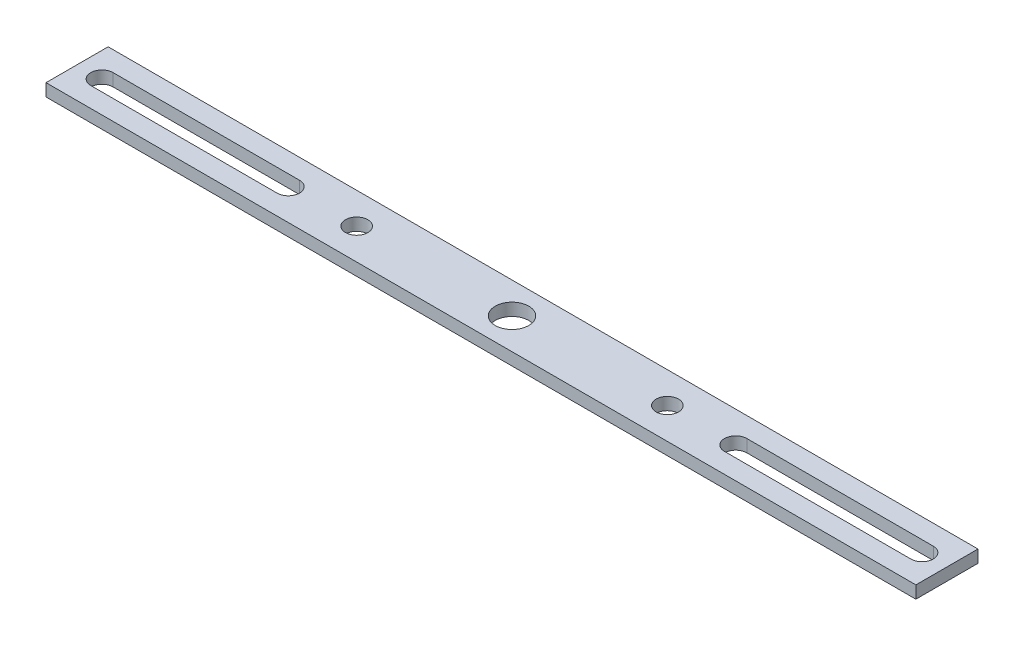
ISO-10303-21;
HEADER;
FILE_DESCRIPTION(('STEP AP214'),'2;1');
FILE_NAME('part.step','',(''),(''),'','','');
FILE_SCHEMA(('AUTOMOTIVE_DESIGN { 1 0 10303 214 1 1 1 1 }'));
ENDSEC;
DATA;
#1=APPLICATION_CONTEXT('core data for automotive mechanical design processes');
#2=APPLICATION_PROTOCOL_DEFINITION('international standard','automotive_design',2000,#1);
#3=PRODUCT_CONTEXT('',#1,'mechanical');
#4=PRODUCT('Part','Part','',(#3));
#5=PRODUCT_RELATED_PRODUCT_CATEGORY('part','',(#4));
#6=PRODUCT_DEFINITION_FORMATION('','',#4);
#7=PRODUCT_DEFINITION_CONTEXT('part definition',#1,'design');
#8=PRODUCT_DEFINITION('design','',#6,#7);
#9=PRODUCT_DEFINITION_SHAPE('','',#8);
#10=(LENGTH_UNIT() NAMED_UNIT(*) SI_UNIT(.MILLI.,.METRE.));
#11=(NAMED_UNIT(*) PLANE_ANGLE_UNIT() SI_UNIT($,.RADIAN.));
#12=(NAMED_UNIT(*) SI_UNIT($,.STERADIAN.) SOLID_ANGLE_UNIT());
#13=UNCERTAINTY_MEASURE_WITH_UNIT(LENGTH_MEASURE(1.E-05),#10,'distance_accuracy_value','');
#14=(GEOMETRIC_REPRESENTATION_CONTEXT(3) GLOBAL_UNCERTAINTY_ASSIGNED_CONTEXT((#13)) GLOBAL_UNIT_ASSIGNED_CONTEXT((#10,
#11,#12)) REPRESENTATION_CONTEXT('',''));
#15=CARTESIAN_POINT('',(0.,0.,0.));
#16=DIRECTION('',(0.,0.,1.));
#17=DIRECTION('',(1.,0.,0.));
#18=AXIS2_PLACEMENT_3D('',#15,#16,#17);
#19=CARTESIAN_POINT('',(0.,2.54,0.));
#20=DIRECTION('',(0.,1.,0.));
#21=DIRECTION('',(0.,0.,1.));
#22=AXIS2_PLACEMENT_3D('',#19,#20,#21);
#23=PLANE('',#22);
#24=CARTESIAN_POINT('',(-31.75,2.54,0.));
#25=DIRECTION('',(0.,1.,0.));
#26=DIRECTION('',(0.,0.,1.));
#27=AXIS2_PLACEMENT_3D('',#24,#25,#26);
#28=CIRCLE('',#27,2.286);
#29=CARTESIAN_POINT('',(-31.75,2.54,2.286));
#30=VERTEX_POINT('',#29);
#31=EDGE_CURVE('E153',#30,#30,#28,.T.);
#32=ORIENTED_EDGE('',*,*,#31,.F.);
#33=EDGE_LOOP('',(#32));
#34=FACE_BOUND('',#33,.T.);
#35=DIRECTION('',(0.,0.,-1.));
#36=VECTOR('',#35,1.);
#37=CARTESIAN_POINT('',(88.9,2.54,-6.35));
#38=LINE('',#37,#36);
#39=CARTESIAN_POINT('',(88.9,2.54,6.35));
#40=VERTEX_POINT('',#39);
#41=CARTESIAN_POINT('',(88.9,2.54,-6.35));
#42=VERTEX_POINT('',#41);
#43=EDGE_CURVE('E200',#40,#42,#38,.T.);
#44=ORIENTED_EDGE('',*,*,#43,.T.);
#45=DIRECTION('',(-1.,0.,0.));
#46=VECTOR('',#45,1.);
#47=CARTESIAN_POINT('',(-88.9,2.54,-6.35));
#48=LINE('',#47,#46);
#49=CARTESIAN_POINT('',(-88.9,2.54,-6.35));
#50=VERTEX_POINT('',#49);
#51=EDGE_CURVE('E203',#42,#50,#48,.T.);
#52=ORIENTED_EDGE('',*,*,#51,.T.);
#53=DIRECTION('',(0.,0.,1.));
#54=VECTOR('',#53,1.);
#55=CARTESIAN_POINT('',(-88.9,2.54,-6.35));
#56=LINE('',#55,#54);
#57=CARTESIAN_POINT('',(-88.9,2.54,6.35));
#58=VERTEX_POINT('',#57);
#59=EDGE_CURVE('E206',#50,#58,#56,.T.);
#60=ORIENTED_EDGE('',*,*,#59,.T.);
#61=DIRECTION('',(1.,0.,0.));
#62=VECTOR('',#61,1.);
#63=CARTESIAN_POINT('',(-88.9,2.54,6.35));
#64=LINE('',#63,#62);
#65=EDGE_CURVE('E208',#58,#40,#64,.T.);
#66=ORIENTED_EDGE('',*,*,#65,.T.);
#67=EDGE_LOOP('',(#44,#52,#60,#66));
#68=FACE_BOUND('',#67,.T.);
#69=CARTESIAN_POINT('',(0.,2.54,0.));
#70=DIRECTION('',(0.,1.,0.));
#71=DIRECTION('',(0.,0.,1.));
#72=AXIS2_PLACEMENT_3D('',#69,#70,#71);
#73=CIRCLE('',#72,3.429);
#74=CARTESIAN_POINT('',(0.,2.54,3.429));
#75=VERTEX_POINT('',#74);
#76=EDGE_CURVE('E194',#75,#75,#73,.T.);
#77=ORIENTED_EDGE('',*,*,#76,.F.);
#78=EDGE_LOOP('',(#77));
#79=FACE_BOUND('',#78,.T.);
#80=DIRECTION('',(1.,0.,0.));
#81=VECTOR('',#80,1.);
#82=CARTESIAN_POINT('',(-83.82,2.54,2.286));
#83=LINE('',#82,#81);
#84=CARTESIAN_POINT('',(-83.82,2.54,2.286));
#85=VERTEX_POINT('',#84);
#86=CARTESIAN_POINT('',(-45.72,2.54,2.286));
#87=VERTEX_POINT('',#86);
#88=EDGE_CURVE('E165',#85,#87,#83,.T.);
#89=ORIENTED_EDGE('',*,*,#88,.F.);
#90=CARTESIAN_POINT('',(-83.82,2.54,0.));
#91=DIRECTION('',(0.,1.,0.));
#92=DIRECTION('',(0.,0.,1.));
#93=AXIS2_PLACEMENT_3D('',#90,#91,#92);
#94=CIRCLE('',#93,2.286);
#95=CARTESIAN_POINT('',(-83.82,2.54,-2.286));
#96=VERTEX_POINT('',#95);
#97=EDGE_CURVE('E163',#96,#85,#94,.T.);
#98=ORIENTED_EDGE('',*,*,#97,.F.);
#99=DIRECTION('',(-1.,0.,0.));
#100=VECTOR('',#99,1.);
#101=CARTESIAN_POINT('',(-83.82,2.54,-2.286));
#102=LINE('',#101,#100);
#103=CARTESIAN_POINT('',(-45.72,2.54,-2.286));
#104=VERTEX_POINT('',#103);
#105=EDGE_CURVE('E171',#104,#96,#102,.T.);
#106=ORIENTED_EDGE('',*,*,#105,.F.);
#107=CARTESIAN_POINT('',(-45.72,2.54,0.));
#108=DIRECTION('',(0.,1.,0.));
#109=DIRECTION('',(0.,0.,1.));
#110=AXIS2_PLACEMENT_3D('',#107,#108,#109);
#111=CIRCLE('',#110,2.286);
#112=EDGE_CURVE('E168',#87,#104,#111,.T.);
#113=ORIENTED_EDGE('',*,*,#112,.F.);
#114=EDGE_LOOP('',(#89,#98,#106,#113));
#115=FACE_BOUND('',#114,.T.);
#116=DIRECTION('',(-1.,0.,0.));
#117=VECTOR('',#116,1.);
#118=CARTESIAN_POINT('',(83.82,2.54,-2.286));
#119=LINE('',#118,#117);
#120=CARTESIAN_POINT('',(83.82,2.54,-2.286));
#121=VERTEX_POINT('',#120);
#122=CARTESIAN_POINT('',(45.72,2.54,-2.286));
#123=VERTEX_POINT('',#122);
#124=EDGE_CURVE('E132',#121,#123,#119,.T.);
#125=ORIENTED_EDGE('',*,*,#124,.F.);
#126=CARTESIAN_POINT('',(83.82,2.54,0.));
#127=DIRECTION('',(0.,1.,0.));
#128=DIRECTION('',(0.,0.,1.));
#129=AXIS2_PLACEMENT_3D('',#126,#127,#128);
#130=CIRCLE('',#129,2.286);
#131=CARTESIAN_POINT('',(83.82,2.54,2.286));
#132=VERTEX_POINT('',#131);
#133=EDGE_CURVE('E124',#132,#121,#130,.T.);
#134=ORIENTED_EDGE('',*,*,#133,.F.);
#135=DIRECTION('',(1.,0.,0.));
#136=VECTOR('',#135,1.);
#137=CARTESIAN_POINT('',(83.82,2.54,2.286));
#138=LINE('',#137,#136);
#139=CARTESIAN_POINT('',(45.72,2.54,2.286));
#140=VERTEX_POINT('',#139);
#141=EDGE_CURVE('E147',#140,#132,#138,.T.);
#142=ORIENTED_EDGE('',*,*,#141,.F.);
#143=CARTESIAN_POINT('',(45.72,2.54,0.));
#144=DIRECTION('',(0.,1.,0.));
#145=DIRECTION('',(0.,0.,1.));
#146=AXIS2_PLACEMENT_3D('',#143,#144,#145);
#147=CIRCLE('',#146,2.286);
#148=EDGE_CURVE('E145',#123,#140,#147,.T.);
#149=ORIENTED_EDGE('',*,*,#148,.F.);
#150=EDGE_LOOP('',(#125,#134,#142,#149));
#151=FACE_BOUND('',#150,.T.);
#152=CARTESIAN_POINT('',(31.75,2.54,0.));
#153=DIRECTION('',(0.,1.,0.));
#154=DIRECTION('',(0.,0.,1.));
#155=AXIS2_PLACEMENT_3D('',#152,#153,#154);
#156=CIRCLE('',#155,2.28600000000001);
#157=CARTESIAN_POINT('',(31.75,2.54,2.28600000000001));
#158=VERTEX_POINT('',#157);
#159=EDGE_CURVE('E288',#158,#158,#156,.T.);
#160=ORIENTED_EDGE('',*,*,#159,.F.);
#161=EDGE_LOOP('',(#160));
#162=FACE_BOUND('',#161,.T.);
#163=ADVANCED_FACE('F35',(#34,#68,#79,#115,#151,#162),#23,.T.);
#164=CARTESIAN_POINT('',(0.,0.,0.));
#165=DIRECTION('',(0.,1.,0.));
#166=DIRECTION('',(0.,0.,1.));
#167=AXIS2_PLACEMENT_3D('',#164,#165,#166);
#168=PLANE('',#167);
#169=CARTESIAN_POINT('',(-83.82,0.,0.));
#170=DIRECTION('',(0.,1.,0.));
#171=DIRECTION('',(0.,0.,1.));
#172=AXIS2_PLACEMENT_3D('',#169,#170,#171);
#173=CIRCLE('',#172,2.286);
#174=CARTESIAN_POINT('',(-83.82,0.,-2.286));
#175=VERTEX_POINT('',#174);
#176=CARTESIAN_POINT('',(-83.82,0.,2.286));
#177=VERTEX_POINT('',#176);
#178=EDGE_CURVE('E140',#175,#177,#173,.T.);
#179=ORIENTED_EDGE('',*,*,#178,.T.);
#180=DIRECTION('',(1.,0.,0.));
#181=VECTOR('',#180,1.);
#182=CARTESIAN_POINT('',(-83.82,0.,2.286));
#183=LINE('',#182,#181);
#184=CARTESIAN_POINT('',(-45.72,0.,2.286));
#185=VERTEX_POINT('',#184);
#186=EDGE_CURVE('E176',#177,#185,#183,.T.);
#187=ORIENTED_EDGE('',*,*,#186,.T.);
#188=CARTESIAN_POINT('',(-45.72,0.,0.));
#189=DIRECTION('',(0.,1.,0.));
#190=DIRECTION('',(0.,0.,1.));
#191=AXIS2_PLACEMENT_3D('',#188,#189,#190);
#192=CIRCLE('',#191,2.286);
#193=CARTESIAN_POINT('',(-45.72,0.,-2.286));
#194=VERTEX_POINT('',#193);
#195=EDGE_CURVE('E179',#185,#194,#192,.T.);
#196=ORIENTED_EDGE('',*,*,#195,.T.);
#197=DIRECTION('',(-1.,0.,0.));
#198=VECTOR('',#197,1.);
#199=CARTESIAN_POINT('',(-83.82,0.,-2.286));
#200=LINE('',#199,#198);
#201=EDGE_CURVE('E166',#194,#175,#200,.T.);
#202=ORIENTED_EDGE('',*,*,#201,.T.);
#203=EDGE_LOOP('',(#179,#187,#196,#202));
#204=FACE_BOUND('',#203,.T.);
#205=DIRECTION('',(0.,0.,-1.));
#206=VECTOR('',#205,1.);
#207=CARTESIAN_POINT('',(88.9,0.,-6.35));
#208=LINE('',#207,#206);
#209=CARTESIAN_POINT('',(88.9,0.,6.35));
#210=VERTEX_POINT('',#209);
#211=CARTESIAN_POINT('',(88.9,0.,-6.35));
#212=VERTEX_POINT('',#211);
#213=EDGE_CURVE('E197',#210,#212,#208,.T.);
#214=ORIENTED_EDGE('',*,*,#213,.F.);
#215=DIRECTION('',(1.,0.,0.));
#216=VECTOR('',#215,1.);
#217=CARTESIAN_POINT('',(-88.9,0.,6.35));
#218=LINE('',#217,#216);
#219=CARTESIAN_POINT('',(-88.9,0.,6.35));
#220=VERTEX_POINT('',#219);
#221=EDGE_CURVE('E204',#220,#210,#218,.T.);
#222=ORIENTED_EDGE('',*,*,#221,.F.);
#223=DIRECTION('',(0.,0.,1.));
#224=VECTOR('',#223,1.);
#225=CARTESIAN_POINT('',(-88.9,0.,-6.35));
#226=LINE('',#225,#224);
#227=CARTESIAN_POINT('',(-88.9,0.,-6.35));
#228=VERTEX_POINT('',#227);
#229=EDGE_CURVE('E215',#228,#220,#226,.T.);
#230=ORIENTED_EDGE('',*,*,#229,.F.);
#231=DIRECTION('',(-1.,0.,0.));
#232=VECTOR('',#231,1.);
#233=CARTESIAN_POINT('',(-88.9,0.,-6.35));
#234=LINE('',#233,#232);
#235=EDGE_CURVE('E213',#212,#228,#234,.T.);
#236=ORIENTED_EDGE('',*,*,#235,.F.);
#237=EDGE_LOOP('',(#214,#222,#230,#236));
#238=FACE_BOUND('',#237,.T.);
#239=CARTESIAN_POINT('',(0.,0.,0.));
#240=DIRECTION('',(0.,1.,0.));
#241=DIRECTION('',(0.,0.,1.));
#242=AXIS2_PLACEMENT_3D('',#239,#240,#241);
#243=CIRCLE('',#242,3.429);
#244=CARTESIAN_POINT('',(0.,0.,3.429));
#245=VERTEX_POINT('',#244);
#246=EDGE_CURVE('E193',#245,#245,#243,.T.);
#247=ORIENTED_EDGE('',*,*,#246,.T.);
#248=EDGE_LOOP('',(#247));
#249=FACE_BOUND('',#248,.T.);
#250=CARTESIAN_POINT('',(83.82,0.,0.));
#251=DIRECTION('',(0.,1.,0.));
#252=DIRECTION('',(0.,0.,1.));
#253=AXIS2_PLACEMENT_3D('',#250,#251,#252);
#254=CIRCLE('',#253,2.286);
#255=CARTESIAN_POINT('',(83.82,0.,2.286));
#256=VERTEX_POINT('',#255);
#257=CARTESIAN_POINT('',(83.82,0.,-2.286));
#258=VERTEX_POINT('',#257);
#259=EDGE_CURVE('E58',#256,#258,#254,.T.);
#260=ORIENTED_EDGE('',*,*,#259,.T.);
#261=DIRECTION('',(-1.,0.,0.));
#262=VECTOR('',#261,1.);
#263=CARTESIAN_POINT('',(83.82,0.,-2.286));
#264=LINE('',#263,#262);
#265=CARTESIAN_POINT('',(45.72,0.,-2.286));
#266=VERTEX_POINT('',#265);
#267=EDGE_CURVE('E139',#258,#266,#264,.T.);
#268=ORIENTED_EDGE('',*,*,#267,.T.);
#269=CARTESIAN_POINT('',(45.72,0.,0.));
#270=DIRECTION('',(0.,1.,0.));
#271=DIRECTION('',(0.,0.,1.));
#272=AXIS2_PLACEMENT_3D('',#269,#270,#271);
#273=CIRCLE('',#272,2.286);
#274=CARTESIAN_POINT('',(45.72,0.,2.286));
#275=VERTEX_POINT('',#274);
#276=EDGE_CURVE('E155',#266,#275,#273,.T.);
#277=ORIENTED_EDGE('',*,*,#276,.T.);
#278=DIRECTION('',(1.,0.,0.));
#279=VECTOR('',#278,1.);
#280=CARTESIAN_POINT('',(83.82,0.,2.286));
#281=LINE('',#280,#279);
#282=EDGE_CURVE('E133',#275,#256,#281,.T.);
#283=ORIENTED_EDGE('',*,*,#282,.T.);
#284=EDGE_LOOP('',(#260,#268,#277,#283));
#285=FACE_BOUND('',#284,.T.);
#286=CARTESIAN_POINT('',(-31.75,0.,0.));
#287=DIRECTION('',(0.,1.,0.));
#288=DIRECTION('',(0.,0.,1.));
#289=AXIS2_PLACEMENT_3D('',#286,#287,#288);
#290=CIRCLE('',#289,2.286);
#291=CARTESIAN_POINT('',(-31.75,0.,2.286));
#292=VERTEX_POINT('',#291);
#293=EDGE_CURVE('E283',#292,#292,#290,.T.);
#294=ORIENTED_EDGE('',*,*,#293,.T.);
#295=EDGE_LOOP('',(#294));
#296=FACE_BOUND('',#295,.T.);
#297=CARTESIAN_POINT('',(31.75,0.,0.));
#298=DIRECTION('',(0.,1.,0.));
#299=DIRECTION('',(0.,0.,1.));
#300=AXIS2_PLACEMENT_3D('',#297,#298,#299);
#301=CIRCLE('',#300,2.28600000000001);
#302=CARTESIAN_POINT('',(31.75,0.,2.28600000000001));
#303=VERTEX_POINT('',#302);
#304=EDGE_CURVE('E286',#303,#303,#301,.T.);
#305=ORIENTED_EDGE('',*,*,#304,.T.);
#306=EDGE_LOOP('',(#305));
#307=FACE_BOUND('',#306,.T.);
#308=ADVANCED_FACE('F233',(#204,#238,#249,#285,#296,#307),#168,.F.);
#309=CARTESIAN_POINT('',(88.9,2.54,-6.35));
#310=DIRECTION('',(-1.,0.,0.));
#311=DIRECTION('',(0.,0.,1.));
#312=AXIS2_PLACEMENT_3D('',#309,#310,#311);
#313=PLANE('',#312);
#314=ORIENTED_EDGE('',*,*,#213,.T.);
#315=DIRECTION('',(0.,-1.,0.));
#316=VECTOR('',#315,1.);
#317=CARTESIAN_POINT('',(88.9,2.54,-6.35));
#318=LINE('',#317,#316);
#319=EDGE_CURVE('E11',#42,#212,#318,.T.);
#320=ORIENTED_EDGE('',*,*,#319,.F.);
#321=ORIENTED_EDGE('',*,*,#43,.F.);
#322=DIRECTION('',(0.,-1.,0.));
#323=VECTOR('',#322,1.);
#324=CARTESIAN_POINT('',(88.9,2.54,6.35));
#325=LINE('',#324,#323);
#326=EDGE_CURVE('E210',#40,#210,#325,.T.);
#327=ORIENTED_EDGE('',*,*,#326,.T.);
#328=EDGE_LOOP('',(#314,#320,#321,#327));
#329=FACE_BOUND('',#328,.T.);
#330=ADVANCED_FACE('F37',(#329),#313,.F.);
#331=CARTESIAN_POINT('',(-88.9,2.54,-6.35));
#332=DIRECTION('',(0.,0.,1.));
#333=DIRECTION('',(1.,0.,0.));
#334=AXIS2_PLACEMENT_3D('',#331,#332,#333);
#335=PLANE('',#334);
#336=ORIENTED_EDGE('',*,*,#235,.T.);
#337=DIRECTION('',(0.,-1.,0.));
#338=VECTOR('',#337,1.);
#339=CARTESIAN_POINT('',(-88.9,2.54,-6.35));
#340=LINE('',#339,#338);
#341=EDGE_CURVE('E43',#50,#228,#340,.T.);
#342=ORIENTED_EDGE('',*,*,#341,.F.);
#343=ORIENTED_EDGE('',*,*,#51,.F.);
#344=ORIENTED_EDGE('',*,*,#319,.T.);
#345=EDGE_LOOP('',(#336,#342,#343,#344));
#346=FACE_BOUND('',#345,.T.);
#347=ADVANCED_FACE('F244',(#346),#335,.F.);
#348=CARTESIAN_POINT('',(-88.9,2.54,-6.35));
#349=DIRECTION('',(1.,0.,0.));
#350=DIRECTION('',(0.,0.,-1.));
#351=AXIS2_PLACEMENT_3D('',#348,#349,#350);
#352=PLANE('',#351);
#353=ORIENTED_EDGE('',*,*,#229,.T.);
#354=DIRECTION('',(0.,-1.,0.));
#355=VECTOR('',#354,1.);
#356=CARTESIAN_POINT('',(-88.9,2.54,6.35));
#357=LINE('',#356,#355);
#358=EDGE_CURVE('E220',#58,#220,#357,.T.);
#359=ORIENTED_EDGE('',*,*,#358,.F.);
#360=ORIENTED_EDGE('',*,*,#59,.F.);
#361=ORIENTED_EDGE('',*,*,#341,.T.);
#362=EDGE_LOOP('',(#353,#359,#360,#361));
#363=FACE_BOUND('',#362,.T.);
#364=ADVANCED_FACE('F227',(#363),#352,.F.);
#365=CARTESIAN_POINT('',(-88.9,2.54,6.35));
#366=DIRECTION('',(0.,0.,-1.));
#367=DIRECTION('',(-1.,0.,0.));
#368=AXIS2_PLACEMENT_3D('',#365,#366,#367);
#369=PLANE('',#368);
#370=ORIENTED_EDGE('',*,*,#221,.T.);
#371=ORIENTED_EDGE('',*,*,#326,.F.);
#372=ORIENTED_EDGE('',*,*,#65,.F.);
#373=ORIENTED_EDGE('',*,*,#358,.T.);
#374=EDGE_LOOP('',(#370,#371,#372,#373));
#375=FACE_BOUND('',#374,.T.);
#376=ADVANCED_FACE('F237',(#375),#369,.F.);
#377=CARTESIAN_POINT('',(0.,2.54,0.));
#378=DIRECTION('',(0.,-1.,0.));
#379=DIRECTION('',(0.,0.,-1.));
#380=AXIS2_PLACEMENT_3D('',#377,#378,#379);
#381=CYLINDRICAL_SURFACE('',#380,3.429);
#382=ORIENTED_EDGE('',*,*,#76,.T.);
#383=EDGE_LOOP('',(#382));
#384=FACE_BOUND('',#383,.T.);
#385=ORIENTED_EDGE('',*,*,#246,.F.);
#386=EDGE_LOOP('',(#385));
#387=FACE_BOUND('',#386,.T.);
#388=ADVANCED_FACE('F261',(#384,#387),#381,.F.);
#389=CARTESIAN_POINT('',(-83.82,2.54,0.));
#390=DIRECTION('',(0.,-1.,0.));
#391=DIRECTION('',(0.,0.,-1.));
#392=AXIS2_PLACEMENT_3D('',#389,#390,#391);
#393=CYLINDRICAL_SURFACE('',#392,2.286);
#394=ORIENTED_EDGE('',*,*,#178,.F.);
#395=DIRECTION('',(0.,-1.,0.));
#396=VECTOR('',#395,1.);
#397=CARTESIAN_POINT('',(-83.82,2.54,-2.286));
#398=LINE('',#397,#396);
#399=EDGE_CURVE('E173',#96,#175,#398,.T.);
#400=ORIENTED_EDGE('',*,*,#399,.F.);
#401=ORIENTED_EDGE('',*,*,#97,.T.);
#402=DIRECTION('',(0.,-1.,0.));
#403=VECTOR('',#402,1.);
#404=CARTESIAN_POINT('',(-83.82,2.54,2.286));
#405=LINE('',#404,#403);
#406=EDGE_CURVE('E190',#85,#177,#405,.T.);
#407=ORIENTED_EDGE('',*,*,#406,.T.);
#408=EDGE_LOOP('',(#394,#400,#401,#407));
#409=FACE_BOUND('',#408,.T.);
#410=ADVANCED_FACE('F268',(#409),#393,.F.);
#411=CARTESIAN_POINT('',(-83.82,2.54,2.286));
#412=DIRECTION('',(0.,0.,-1.));
#413=DIRECTION('',(-1.,0.,0.));
#414=AXIS2_PLACEMENT_3D('',#411,#412,#413);
#415=PLANE('',#414);
#416=ORIENTED_EDGE('',*,*,#186,.F.);
#417=ORIENTED_EDGE('',*,*,#406,.F.);
#418=ORIENTED_EDGE('',*,*,#88,.T.);
#419=DIRECTION('',(0.,-1.,0.));
#420=VECTOR('',#419,1.);
#421=CARTESIAN_POINT('',(-45.72,2.54,2.286));
#422=LINE('',#421,#420);
#423=EDGE_CURVE('E188',#87,#185,#422,.T.);
#424=ORIENTED_EDGE('',*,*,#423,.T.);
#425=EDGE_LOOP('',(#416,#417,#418,#424));
#426=FACE_BOUND('',#425,.T.);
#427=ADVANCED_FACE('F273',(#426),#415,.T.);
#428=CARTESIAN_POINT('',(-45.72,2.54,0.));
#429=DIRECTION('',(0.,-1.,0.));
#430=DIRECTION('',(0.,0.,-1.));
#431=AXIS2_PLACEMENT_3D('',#428,#429,#430);
#432=CYLINDRICAL_SURFACE('',#431,2.286);
#433=ORIENTED_EDGE('',*,*,#195,.F.);
#434=ORIENTED_EDGE('',*,*,#423,.F.);
#435=ORIENTED_EDGE('',*,*,#112,.T.);
#436=DIRECTION('',(0.,-1.,0.));
#437=VECTOR('',#436,1.);
#438=CARTESIAN_POINT('',(-45.72,2.54,-2.286));
#439=LINE('',#438,#437);
#440=EDGE_CURVE('E186',#104,#194,#439,.T.);
#441=ORIENTED_EDGE('',*,*,#440,.T.);
#442=EDGE_LOOP('',(#433,#434,#435,#441));
#443=FACE_BOUND('',#442,.T.);
#444=ADVANCED_FACE('F320',(#443),#432,.F.);
#445=CARTESIAN_POINT('',(-83.82,2.54,-2.286));
#446=DIRECTION('',(0.,0.,1.));
#447=DIRECTION('',(1.,0.,0.));
#448=AXIS2_PLACEMENT_3D('',#445,#446,#447);
#449=PLANE('',#448);
#450=ORIENTED_EDGE('',*,*,#201,.F.);
#451=ORIENTED_EDGE('',*,*,#440,.F.);
#452=ORIENTED_EDGE('',*,*,#105,.T.);
#453=ORIENTED_EDGE('',*,*,#399,.T.);
#454=EDGE_LOOP('',(#450,#451,#452,#453));
#455=FACE_BOUND('',#454,.T.);
#456=ADVANCED_FACE('F317',(#455),#449,.T.);
#457=CARTESIAN_POINT('',(83.82,2.54,0.));
#458=DIRECTION('',(0.,-1.,0.));
#459=DIRECTION('',(0.,0.,-1.));
#460=AXIS2_PLACEMENT_3D('',#457,#458,#459);
#461=CYLINDRICAL_SURFACE('',#460,2.286);
#462=ORIENTED_EDGE('',*,*,#259,.F.);
#463=DIRECTION('',(0.,-1.,0.));
#464=VECTOR('',#463,1.);
#465=CARTESIAN_POINT('',(83.82,2.54,2.286));
#466=LINE('',#465,#464);
#467=EDGE_CURVE('E128',#132,#256,#466,.T.);
#468=ORIENTED_EDGE('',*,*,#467,.F.);
#469=ORIENTED_EDGE('',*,*,#133,.T.);
#470=DIRECTION('',(0.,-1.,0.));
#471=VECTOR('',#470,1.);
#472=CARTESIAN_POINT('',(83.82,2.54,-2.286));
#473=LINE('',#472,#471);
#474=EDGE_CURVE('E127',#121,#258,#473,.T.);
#475=ORIENTED_EDGE('',*,*,#474,.T.);
#476=EDGE_LOOP('',(#462,#468,#469,#475));
#477=FACE_BOUND('',#476,.T.);
#478=ADVANCED_FACE('F126',(#477),#461,.F.);
#479=CARTESIAN_POINT('',(83.82,2.54,-2.286));
#480=DIRECTION('',(0.,0.,1.));
#481=DIRECTION('',(1.,0.,0.));
#482=AXIS2_PLACEMENT_3D('',#479,#480,#481);
#483=PLANE('',#482);
#484=ORIENTED_EDGE('',*,*,#267,.F.);
#485=ORIENTED_EDGE('',*,*,#474,.F.);
#486=ORIENTED_EDGE('',*,*,#124,.T.);
#487=DIRECTION('',(0.,-1.,0.));
#488=VECTOR('',#487,1.);
#489=CARTESIAN_POINT('',(45.72,2.54,-2.286));
#490=LINE('',#489,#488);
#491=EDGE_CURVE('E141',#123,#266,#490,.T.);
#492=ORIENTED_EDGE('',*,*,#491,.T.);
#493=EDGE_LOOP('',(#484,#485,#486,#492));
#494=FACE_BOUND('',#493,.T.);
#495=ADVANCED_FACE('F136',(#494),#483,.T.);
#496=CARTESIAN_POINT('',(45.72,2.54,0.));
#497=DIRECTION('',(0.,-1.,0.));
#498=DIRECTION('',(0.,0.,-1.));
#499=AXIS2_PLACEMENT_3D('',#496,#497,#498);
#500=CYLINDRICAL_SURFACE('',#499,2.286);
#501=ORIENTED_EDGE('',*,*,#276,.F.);
#502=ORIENTED_EDGE('',*,*,#491,.F.);
#503=ORIENTED_EDGE('',*,*,#148,.T.);
#504=DIRECTION('',(0.,-1.,0.));
#505=VECTOR('',#504,1.);
#506=CARTESIAN_POINT('',(45.72,2.54,2.286));
#507=LINE('',#506,#505);
#508=EDGE_CURVE('E50',#140,#275,#507,.T.);
#509=ORIENTED_EDGE('',*,*,#508,.T.);
#510=EDGE_LOOP('',(#501,#502,#503,#509));
#511=FACE_BOUND('',#510,.T.);
#512=ADVANCED_FACE('F307',(#511),#500,.F.);
#513=CARTESIAN_POINT('',(83.82,2.54,2.286));
#514=DIRECTION('',(0.,0.,-1.));
#515=DIRECTION('',(-1.,0.,0.));
#516=AXIS2_PLACEMENT_3D('',#513,#514,#515);
#517=PLANE('',#516);
#518=ORIENTED_EDGE('',*,*,#282,.F.);
#519=ORIENTED_EDGE('',*,*,#508,.F.);
#520=ORIENTED_EDGE('',*,*,#141,.T.);
#521=ORIENTED_EDGE('',*,*,#467,.T.);
#522=EDGE_LOOP('',(#518,#519,#520,#521));
#523=FACE_BOUND('',#522,.T.);
#524=ADVANCED_FACE('F299',(#523),#517,.T.);
#525=CARTESIAN_POINT('',(-31.75,2.54,0.));
#526=DIRECTION('',(0.,-1.,0.));
#527=DIRECTION('',(0.,0.,-1.));
#528=AXIS2_PLACEMENT_3D('',#525,#526,#527);
#529=CYLINDRICAL_SURFACE('',#528,2.286);
#530=ORIENTED_EDGE('',*,*,#31,.T.);
#531=EDGE_LOOP('',(#530));
#532=FACE_BOUND('',#531,.T.);
#533=ORIENTED_EDGE('',*,*,#293,.F.);
#534=EDGE_LOOP('',(#533));
#535=FACE_BOUND('',#534,.T.);
#536=ADVANCED_FACE('F295',(#532,#535),#529,.F.);
#537=CARTESIAN_POINT('',(31.75,2.54,0.));
#538=DIRECTION('',(0.,-1.,0.));
#539=DIRECTION('',(0.,0.,-1.));
#540=AXIS2_PLACEMENT_3D('',#537,#538,#539);
#541=CYLINDRICAL_SURFACE('',#540,2.28600000000001);
#542=ORIENTED_EDGE('',*,*,#159,.T.);
#543=EDGE_LOOP('',(#542));
#544=FACE_BOUND('',#543,.T.);
#545=ORIENTED_EDGE('',*,*,#304,.F.);
#546=EDGE_LOOP('',(#545));
#547=FACE_BOUND('',#546,.T.);
#548=ADVANCED_FACE('F298',(#544,#547),#541,.F.);
#549=CLOSED_SHELL('',(#163,#308,#330,#347,#364,#376,#388,#410,#427,#444,#456,#478,#495,#512,
#524,#536,#548));
#550=MANIFOLD_SOLID_BREP('B2',#549);
#551=ADVANCED_BREP_SHAPE_REPRESENTATION('',(#18,#550),#14);
#552=SHAPE_DEFINITION_REPRESENTATION(#9,#551);
ENDSEC;
END-ISO-10303-21;
